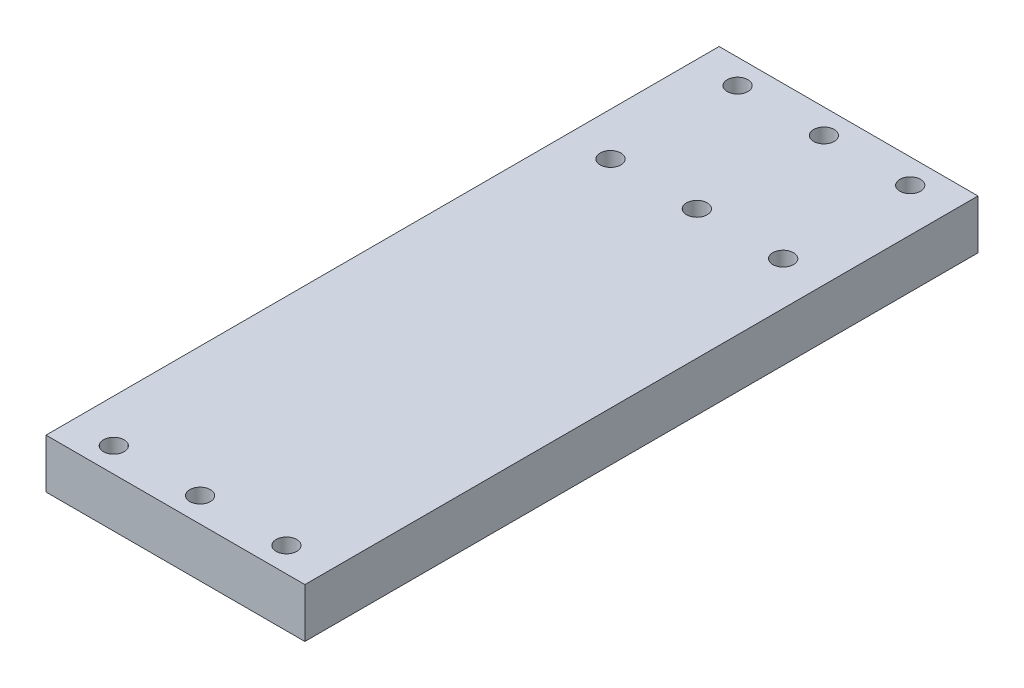
ISO-10303-21;
HEADER;
FILE_DESCRIPTION(('STEP AP214'),'2;1');
FILE_NAME('part.step','',(''),(''),'','','');
FILE_SCHEMA(('AUTOMOTIVE_DESIGN { 1 0 10303 214 1 1 1 1 }'));
ENDSEC;
DATA;
#1=APPLICATION_CONTEXT('core data for automotive mechanical design processes');
#2=APPLICATION_PROTOCOL_DEFINITION('international standard','automotive_design',2000,#1);
#3=PRODUCT_CONTEXT('',#1,'mechanical');
#4=PRODUCT('Part','Part','',(#3));
#5=PRODUCT_RELATED_PRODUCT_CATEGORY('part','',(#4));
#6=PRODUCT_DEFINITION_FORMATION('','',#4);
#7=PRODUCT_DEFINITION_CONTEXT('part definition',#1,'design');
#8=PRODUCT_DEFINITION('design','',#6,#7);
#9=PRODUCT_DEFINITION_SHAPE('','',#8);
#10=(LENGTH_UNIT() NAMED_UNIT(*) SI_UNIT(.MILLI.,.METRE.));
#11=(NAMED_UNIT(*) PLANE_ANGLE_UNIT() SI_UNIT($,.RADIAN.));
#12=(NAMED_UNIT(*) SI_UNIT($,.STERADIAN.) SOLID_ANGLE_UNIT());
#13=UNCERTAINTY_MEASURE_WITH_UNIT(LENGTH_MEASURE(1.E-05),#10,'distance_accuracy_value','');
#14=(GEOMETRIC_REPRESENTATION_CONTEXT(3) GLOBAL_UNCERTAINTY_ASSIGNED_CONTEXT((#13)) GLOBAL_UNIT_ASSIGNED_CONTEXT((#10,
#11,#12)) REPRESENTATION_CONTEXT('',''));
#15=CARTESIAN_POINT('',(0.,0.,0.));
#16=DIRECTION('',(0.,0.,1.));
#17=DIRECTION('',(1.,0.,0.));
#18=AXIS2_PLACEMENT_3D('',#15,#16,#17);
#19=CARTESIAN_POINT('',(25.,9.525,65.));
#20=DIRECTION('',(-1.,0.,0.));
#21=DIRECTION('',(0.,0.,1.));
#22=AXIS2_PLACEMENT_3D('',#19,#20,#21);
#23=PLANE('',#22);
#24=DIRECTION('',(0.,0.,-1.));
#25=VECTOR('',#24,1.);
#26=CARTESIAN_POINT('',(25.,0.,65.));
#27=LINE('',#26,#25);
#28=CARTESIAN_POINT('',(25.,0.,65.));
#29=VERTEX_POINT('',#28);
#30=CARTESIAN_POINT('',(25.,0.,-65.));
#31=VERTEX_POINT('',#30);
#32=EDGE_CURVE('E102',#29,#31,#27,.T.);
#33=ORIENTED_EDGE('',*,*,#32,.T.);
#34=DIRECTION('',(0.,-1.,0.));
#35=VECTOR('',#34,1.);
#36=CARTESIAN_POINT('',(25.,9.525,-65.));
#37=LINE('',#36,#35);
#38=CARTESIAN_POINT('',(25.,9.525,-65.));
#39=VERTEX_POINT('',#38);
#40=EDGE_CURVE('E11',#39,#31,#37,.T.);
#41=ORIENTED_EDGE('',*,*,#40,.F.);
#42=DIRECTION('',(0.,0.,-1.));
#43=VECTOR('',#42,1.);
#44=CARTESIAN_POINT('',(25.,9.525,65.));
#45=LINE('',#44,#43);
#46=CARTESIAN_POINT('',(25.,9.525,65.));
#47=VERTEX_POINT('',#46);
#48=EDGE_CURVE('E90',#47,#39,#45,.T.);
#49=ORIENTED_EDGE('',*,*,#48,.F.);
#50=DIRECTION('',(0.,-1.,0.));
#51=VECTOR('',#50,1.);
#52=CARTESIAN_POINT('',(25.,9.525,65.));
#53=LINE('',#52,#51);
#54=EDGE_CURVE('E98',#47,#29,#53,.T.);
#55=ORIENTED_EDGE('',*,*,#54,.T.);
#56=EDGE_LOOP('',(#33,#41,#49,#55));
#57=FACE_BOUND('',#56,.T.);
#58=ADVANCED_FACE('F39',(#57),#23,.F.);
#59=CARTESIAN_POINT('',(-25.,9.525,-65.));
#60=DIRECTION('',(0.,0.,1.));
#61=DIRECTION('',(1.,0.,0.));
#62=AXIS2_PLACEMENT_3D('',#59,#60,#61);
#63=PLANE('',#62);
#64=DIRECTION('',(-1.,0.,0.));
#65=VECTOR('',#64,1.);
#66=CARTESIAN_POINT('',(-25.,0.,-65.));
#67=LINE('',#66,#65);
#68=CARTESIAN_POINT('',(-25.,0.,-65.));
#69=VERTEX_POINT('',#68);
#70=EDGE_CURVE('E94',#31,#69,#67,.T.);
#71=ORIENTED_EDGE('',*,*,#70,.T.);
#72=DIRECTION('',(0.,-1.,0.));
#73=VECTOR('',#72,1.);
#74=CARTESIAN_POINT('',(-25.,9.525,-65.));
#75=LINE('',#74,#73);
#76=CARTESIAN_POINT('',(-25.,9.525,-65.));
#77=VERTEX_POINT('',#76);
#78=EDGE_CURVE('E47',#77,#69,#75,.T.);
#79=ORIENTED_EDGE('',*,*,#78,.F.);
#80=DIRECTION('',(-1.,0.,0.));
#81=VECTOR('',#80,1.);
#82=CARTESIAN_POINT('',(-25.,9.525,-65.));
#83=LINE('',#82,#81);
#84=EDGE_CURVE('E85',#39,#77,#83,.T.);
#85=ORIENTED_EDGE('',*,*,#84,.F.);
#86=ORIENTED_EDGE('',*,*,#40,.T.);
#87=EDGE_LOOP('',(#71,#79,#85,#86));
#88=FACE_BOUND('',#87,.T.);
#89=ADVANCED_FACE('F93',(#88),#63,.F.);
#90=CARTESIAN_POINT('',(-25.,9.525,65.));
#91=DIRECTION('',(1.,0.,0.));
#92=DIRECTION('',(0.,0.,-1.));
#93=AXIS2_PLACEMENT_3D('',#90,#91,#92);
#94=PLANE('',#93);
#95=DIRECTION('',(0.,0.,1.));
#96=VECTOR('',#95,1.);
#97=CARTESIAN_POINT('',(-25.,0.,65.));
#98=LINE('',#97,#96);
#99=CARTESIAN_POINT('',(-25.,0.,65.));
#100=VERTEX_POINT('',#99);
#101=EDGE_CURVE('E72',#69,#100,#98,.T.);
#102=ORIENTED_EDGE('',*,*,#101,.T.);
#103=DIRECTION('',(0.,-1.,0.));
#104=VECTOR('',#103,1.);
#105=CARTESIAN_POINT('',(-25.,9.525,65.));
#106=LINE('',#105,#104);
#107=CARTESIAN_POINT('',(-25.,9.525,65.));
#108=VERTEX_POINT('',#107);
#109=EDGE_CURVE('E95',#108,#100,#106,.T.);
#110=ORIENTED_EDGE('',*,*,#109,.F.);
#111=DIRECTION('',(0.,0.,1.));
#112=VECTOR('',#111,1.);
#113=CARTESIAN_POINT('',(-25.,9.525,65.));
#114=LINE('',#113,#112);
#115=EDGE_CURVE('E88',#77,#108,#114,.T.);
#116=ORIENTED_EDGE('',*,*,#115,.F.);
#117=ORIENTED_EDGE('',*,*,#78,.T.);
#118=EDGE_LOOP('',(#102,#110,#116,#117));
#119=FACE_BOUND('',#118,.T.);
#120=ADVANCED_FACE('F96',(#119),#94,.F.);
#121=CARTESIAN_POINT('',(-25.,9.525,65.));
#122=DIRECTION('',(0.,0.,-1.));
#123=DIRECTION('',(-1.,0.,0.));
#124=AXIS2_PLACEMENT_3D('',#121,#122,#123);
#125=PLANE('',#124);
#126=DIRECTION('',(1.,0.,0.));
#127=VECTOR('',#126,1.);
#128=CARTESIAN_POINT('',(-25.,0.,65.));
#129=LINE('',#128,#127);
#130=EDGE_CURVE('E78',#100,#29,#129,.T.);
#131=ORIENTED_EDGE('',*,*,#130,.T.);
#132=ORIENTED_EDGE('',*,*,#54,.F.);
#133=DIRECTION('',(1.,0.,0.));
#134=VECTOR('',#133,1.);
#135=CARTESIAN_POINT('',(-25.,9.525,65.));
#136=LINE('',#135,#134);
#137=EDGE_CURVE('E55',#108,#47,#136,.T.);
#138=ORIENTED_EDGE('',*,*,#137,.F.);
#139=ORIENTED_EDGE('',*,*,#109,.T.);
#140=EDGE_LOOP('',(#131,#132,#138,#139));
#141=FACE_BOUND('',#140,.T.);
#142=ADVANCED_FACE('F110',(#141),#125,.F.);
#143=CARTESIAN_POINT('',(0.,9.525,0.));
#144=DIRECTION('',(0.,-1.,0.));
#145=DIRECTION('',(0.,0.,-1.));
#146=AXIS2_PLACEMENT_3D('',#143,#144,#145);
#147=PLANE('',#146);
#148=CARTESIAN_POINT('',(-16.67,9.525,-35.7));
#149=DIRECTION('',(0.,-1.,0.));
#150=DIRECTION('',(0.,0.,-1.));
#151=AXIS2_PLACEMENT_3D('',#148,#149,#150);
#152=CIRCLE('',#151,2.);
#153=CARTESIAN_POINT('',(-16.67,9.525,-37.7));
#154=VERTEX_POINT('',#153);
#155=EDGE_CURVE('E163',#154,#154,#152,.T.);
#156=ORIENTED_EDGE('',*,*,#155,.T.);
#157=EDGE_LOOP('',(#156));
#158=FACE_BOUND('',#157,.T.);
#159=CARTESIAN_POINT('',(0.,9.525,-35.7));
#160=DIRECTION('',(0.,-1.,0.));
#161=DIRECTION('',(0.,0.,-1.));
#162=AXIS2_PLACEMENT_3D('',#159,#160,#161);
#163=CIRCLE('',#162,2.);
#164=CARTESIAN_POINT('',(0.,9.525,-37.7));
#165=VERTEX_POINT('',#164);
#166=EDGE_CURVE('E157',#165,#165,#163,.T.);
#167=ORIENTED_EDGE('',*,*,#166,.T.);
#168=EDGE_LOOP('',(#167));
#169=FACE_BOUND('',#168,.T.);
#170=CARTESIAN_POINT('',(16.67,9.525,-35.7));
#171=DIRECTION('',(0.,-1.,0.));
#172=DIRECTION('',(0.,0.,-1.));
#173=AXIS2_PLACEMENT_3D('',#170,#171,#172);
#174=CIRCLE('',#173,2.);
#175=CARTESIAN_POINT('',(16.67,9.525,-37.7));
#176=VERTEX_POINT('',#175);
#177=EDGE_CURVE('E151',#176,#176,#174,.T.);
#178=ORIENTED_EDGE('',*,*,#177,.T.);
#179=EDGE_LOOP('',(#178));
#180=FACE_BOUND('',#179,.T.);
#181=CARTESIAN_POINT('',(16.67,9.525,60.2375));
#182=DIRECTION('',(0.,-1.,0.));
#183=DIRECTION('',(0.,0.,-1.));
#184=AXIS2_PLACEMENT_3D('',#181,#182,#183);
#185=CIRCLE('',#184,2.);
#186=CARTESIAN_POINT('',(16.67,9.525,58.2375));
#187=VERTEX_POINT('',#186);
#188=EDGE_CURVE('E145',#187,#187,#185,.T.);
#189=ORIENTED_EDGE('',*,*,#188,.T.);
#190=EDGE_LOOP('',(#189));
#191=FACE_BOUND('',#190,.T.);
#192=CARTESIAN_POINT('',(0.,9.525,60.2375));
#193=DIRECTION('',(0.,-1.,0.));
#194=DIRECTION('',(0.,0.,-1.));
#195=AXIS2_PLACEMENT_3D('',#192,#193,#194);
#196=CIRCLE('',#195,2.);
#197=CARTESIAN_POINT('',(0.,9.525,58.2375));
#198=VERTEX_POINT('',#197);
#199=EDGE_CURVE('E139',#198,#198,#196,.T.);
#200=ORIENTED_EDGE('',*,*,#199,.T.);
#201=EDGE_LOOP('',(#200));
#202=FACE_BOUND('',#201,.T.);
#203=CARTESIAN_POINT('',(-16.67,9.525,60.2375));
#204=DIRECTION('',(0.,-1.,0.));
#205=DIRECTION('',(0.,0.,-1.));
#206=AXIS2_PLACEMENT_3D('',#203,#204,#205);
#207=CIRCLE('',#206,2.);
#208=CARTESIAN_POINT('',(-16.67,9.525,58.2375));
#209=VERTEX_POINT('',#208);
#210=EDGE_CURVE('E133',#209,#209,#207,.T.);
#211=ORIENTED_EDGE('',*,*,#210,.T.);
#212=EDGE_LOOP('',(#211));
#213=FACE_BOUND('',#212,.T.);
#214=CARTESIAN_POINT('',(16.6700000000011,9.525,-60.2374999999997));
#215=DIRECTION('',(0.,-1.,0.));
#216=DIRECTION('',(0.,0.,-1.));
#217=AXIS2_PLACEMENT_3D('',#214,#215,#216);
#218=CIRCLE('',#217,2.);
#219=CARTESIAN_POINT('',(16.6700000000011,9.525,-62.2374999999997));
#220=VERTEX_POINT('',#219);
#221=EDGE_CURVE('E127',#220,#220,#218,.T.);
#222=ORIENTED_EDGE('',*,*,#221,.T.);
#223=EDGE_LOOP('',(#222));
#224=FACE_BOUND('',#223,.T.);
#225=CARTESIAN_POINT('',(1.0989801176793E-12,9.525,-60.2374999999997));
#226=DIRECTION('',(0.,-1.,0.));
#227=DIRECTION('',(0.,0.,-1.));
#228=AXIS2_PLACEMENT_3D('',#225,#226,#227);
#229=CIRCLE('',#228,2.);
#230=CARTESIAN_POINT('',(1.0989801176793E-12,9.525,-62.2374999999997));
#231=VERTEX_POINT('',#230);
#232=EDGE_CURVE('E121',#231,#231,#229,.T.);
#233=ORIENTED_EDGE('',*,*,#232,.T.);
#234=EDGE_LOOP('',(#233));
#235=FACE_BOUND('',#234,.T.);
#236=CARTESIAN_POINT('',(-16.6699999999989,9.525,-60.2374999999997));
#237=DIRECTION('',(0.,-1.,0.));
#238=DIRECTION('',(0.,0.,-1.));
#239=AXIS2_PLACEMENT_3D('',#236,#237,#238);
#240=CIRCLE('',#239,2.);
#241=CARTESIAN_POINT('',(-16.6699999999989,9.525,-62.2374999999997));
#242=VERTEX_POINT('',#241);
#243=EDGE_CURVE('E105',#242,#242,#240,.T.);
#244=ORIENTED_EDGE('',*,*,#243,.T.);
#245=EDGE_LOOP('',(#244));
#246=FACE_BOUND('',#245,.T.);
#247=ORIENTED_EDGE('',*,*,#48,.T.);
#248=ORIENTED_EDGE('',*,*,#84,.T.);
#249=ORIENTED_EDGE('',*,*,#115,.T.);
#250=ORIENTED_EDGE('',*,*,#137,.T.);
#251=EDGE_LOOP('',(#247,#248,#249,#250));
#252=FACE_BOUND('',#251,.T.);
#253=ADVANCED_FACE('F86',(#158,#169,#180,#191,#202,#213,#224,#235,#246,#252),#147,.F.);
#254=CARTESIAN_POINT('',(0.,0.,0.));
#255=DIRECTION('',(0.,-1.,0.));
#256=DIRECTION('',(0.,0.,-1.));
#257=AXIS2_PLACEMENT_3D('',#254,#255,#256);
#258=PLANE('',#257);
#259=CARTESIAN_POINT('',(-16.67,0.,-35.7));
#260=DIRECTION('',(0.,-1.,0.));
#261=DIRECTION('',(0.,0.,-1.));
#262=AXIS2_PLACEMENT_3D('',#259,#260,#261);
#263=CIRCLE('',#262,1.99999999999999);
#264=CARTESIAN_POINT('',(-16.67,0.,-37.7));
#265=VERTEX_POINT('',#264);
#266=EDGE_CURVE('E166',#265,#265,#263,.T.);
#267=ORIENTED_EDGE('',*,*,#266,.F.);
#268=EDGE_LOOP('',(#267));
#269=FACE_BOUND('',#268,.T.);
#270=CARTESIAN_POINT('',(0.,0.,-35.7));
#271=DIRECTION('',(0.,-1.,0.));
#272=DIRECTION('',(0.,0.,-1.));
#273=AXIS2_PLACEMENT_3D('',#270,#271,#272);
#274=CIRCLE('',#273,1.99999999999999);
#275=CARTESIAN_POINT('',(0.,0.,-37.7));
#276=VERTEX_POINT('',#275);
#277=EDGE_CURVE('E160',#276,#276,#274,.T.);
#278=ORIENTED_EDGE('',*,*,#277,.F.);
#279=EDGE_LOOP('',(#278));
#280=FACE_BOUND('',#279,.T.);
#281=CARTESIAN_POINT('',(16.67,0.,-35.7));
#282=DIRECTION('',(0.,-1.,0.));
#283=DIRECTION('',(0.,0.,-1.));
#284=AXIS2_PLACEMENT_3D('',#281,#282,#283);
#285=CIRCLE('',#284,1.99999999999999);
#286=CARTESIAN_POINT('',(16.67,0.,-37.7));
#287=VERTEX_POINT('',#286);
#288=EDGE_CURVE('E154',#287,#287,#285,.T.);
#289=ORIENTED_EDGE('',*,*,#288,.F.);
#290=EDGE_LOOP('',(#289));
#291=FACE_BOUND('',#290,.T.);
#292=CARTESIAN_POINT('',(16.67,0.,60.2375));
#293=DIRECTION('',(0.,-1.,0.));
#294=DIRECTION('',(0.,0.,-1.));
#295=AXIS2_PLACEMENT_3D('',#292,#293,#294);
#296=CIRCLE('',#295,1.99999999999999);
#297=CARTESIAN_POINT('',(16.67,0.,58.2375));
#298=VERTEX_POINT('',#297);
#299=EDGE_CURVE('E148',#298,#298,#296,.T.);
#300=ORIENTED_EDGE('',*,*,#299,.F.);
#301=EDGE_LOOP('',(#300));
#302=FACE_BOUND('',#301,.T.);
#303=CARTESIAN_POINT('',(0.,0.,60.2375));
#304=DIRECTION('',(0.,-1.,0.));
#305=DIRECTION('',(0.,0.,-1.));
#306=AXIS2_PLACEMENT_3D('',#303,#304,#305);
#307=CIRCLE('',#306,1.99999999999999);
#308=CARTESIAN_POINT('',(0.,0.,58.2375));
#309=VERTEX_POINT('',#308);
#310=EDGE_CURVE('E142',#309,#309,#307,.T.);
#311=ORIENTED_EDGE('',*,*,#310,.F.);
#312=EDGE_LOOP('',(#311));
#313=FACE_BOUND('',#312,.T.);
#314=CARTESIAN_POINT('',(-16.67,0.,60.2375));
#315=DIRECTION('',(0.,-1.,0.));
#316=DIRECTION('',(0.,0.,-1.));
#317=AXIS2_PLACEMENT_3D('',#314,#315,#316);
#318=CIRCLE('',#317,1.99999999999999);
#319=CARTESIAN_POINT('',(-16.67,0.,58.2375));
#320=VERTEX_POINT('',#319);
#321=EDGE_CURVE('E136',#320,#320,#318,.T.);
#322=ORIENTED_EDGE('',*,*,#321,.F.);
#323=EDGE_LOOP('',(#322));
#324=FACE_BOUND('',#323,.T.);
#325=CARTESIAN_POINT('',(16.6700000000011,0.,-60.2374999999997));
#326=DIRECTION('',(0.,-1.,0.));
#327=DIRECTION('',(0.,0.,-1.));
#328=AXIS2_PLACEMENT_3D('',#325,#326,#327);
#329=CIRCLE('',#328,1.99999999999999);
#330=CARTESIAN_POINT('',(16.6700000000011,0.,-62.2374999999997));
#331=VERTEX_POINT('',#330);
#332=EDGE_CURVE('E130',#331,#331,#329,.T.);
#333=ORIENTED_EDGE('',*,*,#332,.F.);
#334=EDGE_LOOP('',(#333));
#335=FACE_BOUND('',#334,.T.);
#336=CARTESIAN_POINT('',(1.0989801176793E-12,0.,-60.2374999999997));
#337=DIRECTION('',(0.,-1.,0.));
#338=DIRECTION('',(0.,0.,-1.));
#339=AXIS2_PLACEMENT_3D('',#336,#337,#338);
#340=CIRCLE('',#339,1.99999999999999);
#341=CARTESIAN_POINT('',(1.0989801176793E-12,0.,-62.2374999999997));
#342=VERTEX_POINT('',#341);
#343=EDGE_CURVE('E124',#342,#342,#340,.T.);
#344=ORIENTED_EDGE('',*,*,#343,.F.);
#345=EDGE_LOOP('',(#344));
#346=FACE_BOUND('',#345,.T.);
#347=CARTESIAN_POINT('',(-16.6699999999989,0.,-60.2374999999997));
#348=DIRECTION('',(0.,-1.,0.));
#349=DIRECTION('',(0.,0.,-1.));
#350=AXIS2_PLACEMENT_3D('',#347,#348,#349);
#351=CIRCLE('',#350,1.99999999999999);
#352=CARTESIAN_POINT('',(-16.6699999999989,0.,-62.2374999999997));
#353=VERTEX_POINT('',#352);
#354=EDGE_CURVE('E118',#353,#353,#351,.T.);
#355=ORIENTED_EDGE('',*,*,#354,.F.);
#356=EDGE_LOOP('',(#355));
#357=FACE_BOUND('',#356,.T.);
#358=ORIENTED_EDGE('',*,*,#32,.F.);
#359=ORIENTED_EDGE('',*,*,#130,.F.);
#360=ORIENTED_EDGE('',*,*,#101,.F.);
#361=ORIENTED_EDGE('',*,*,#70,.F.);
#362=EDGE_LOOP('',(#358,#359,#360,#361));
#363=FACE_BOUND('',#362,.T.);
#364=ADVANCED_FACE('F113',(#269,#280,#291,#302,#313,#324,#335,#346,#357,#363),#258,.T.);
#365=CARTESIAN_POINT('',(-16.6699999999989,0.,-60.2374999999997));
#366=DIRECTION('',(0.,-1.,0.));
#367=DIRECTION('',(0.,0.,-1.));
#368=AXIS2_PLACEMENT_3D('',#365,#366,#367);
#369=CYLINDRICAL_SURFACE('',#368,1.99999999999999);
#370=ORIENTED_EDGE('',*,*,#243,.F.);
#371=EDGE_LOOP('',(#370));
#372=FACE_BOUND('',#371,.T.);
#373=ORIENTED_EDGE('',*,*,#354,.T.);
#374=EDGE_LOOP('',(#373));
#375=FACE_BOUND('',#374,.T.);
#376=ADVANCED_FACE('F174',(#372,#375),#369,.F.);
#377=CARTESIAN_POINT('',(1.0989801176793E-12,0.,-60.2374999999997));
#378=DIRECTION('',(0.,-1.,0.));
#379=DIRECTION('',(0.,0.,-1.));
#380=AXIS2_PLACEMENT_3D('',#377,#378,#379);
#381=CYLINDRICAL_SURFACE('',#380,1.99999999999999);
#382=ORIENTED_EDGE('',*,*,#232,.F.);
#383=EDGE_LOOP('',(#382));
#384=FACE_BOUND('',#383,.T.);
#385=ORIENTED_EDGE('',*,*,#343,.T.);
#386=EDGE_LOOP('',(#385));
#387=FACE_BOUND('',#386,.T.);
#388=ADVANCED_FACE('F193',(#384,#387),#381,.F.);
#389=CARTESIAN_POINT('',(16.6700000000011,0.,-60.2374999999997));
#390=DIRECTION('',(0.,-1.,0.));
#391=DIRECTION('',(0.,0.,-1.));
#392=AXIS2_PLACEMENT_3D('',#389,#390,#391);
#393=CYLINDRICAL_SURFACE('',#392,1.99999999999999);
#394=ORIENTED_EDGE('',*,*,#221,.F.);
#395=EDGE_LOOP('',(#394));
#396=FACE_BOUND('',#395,.T.);
#397=ORIENTED_EDGE('',*,*,#332,.T.);
#398=EDGE_LOOP('',(#397));
#399=FACE_BOUND('',#398,.T.);
#400=ADVANCED_FACE('F199',(#396,#399),#393,.F.);
#401=CARTESIAN_POINT('',(-16.67,0.,60.2375));
#402=DIRECTION('',(0.,-1.,0.));
#403=DIRECTION('',(0.,0.,-1.));
#404=AXIS2_PLACEMENT_3D('',#401,#402,#403);
#405=CYLINDRICAL_SURFACE('',#404,1.99999999999999);
#406=ORIENTED_EDGE('',*,*,#210,.F.);
#407=EDGE_LOOP('',(#406));
#408=FACE_BOUND('',#407,.T.);
#409=ORIENTED_EDGE('',*,*,#321,.T.);
#410=EDGE_LOOP('',(#409));
#411=FACE_BOUND('',#410,.T.);
#412=ADVANCED_FACE('F238',(#408,#411),#405,.F.);
#413=CARTESIAN_POINT('',(0.,0.,60.2375));
#414=DIRECTION('',(0.,-1.,0.));
#415=DIRECTION('',(0.,0.,-1.));
#416=AXIS2_PLACEMENT_3D('',#413,#414,#415);
#417=CYLINDRICAL_SURFACE('',#416,1.99999999999999);
#418=ORIENTED_EDGE('',*,*,#199,.F.);
#419=EDGE_LOOP('',(#418));
#420=FACE_BOUND('',#419,.T.);
#421=ORIENTED_EDGE('',*,*,#310,.T.);
#422=EDGE_LOOP('',(#421));
#423=FACE_BOUND('',#422,.T.);
#424=ADVANCED_FACE('F243',(#420,#423),#417,.F.);
#425=CARTESIAN_POINT('',(16.67,0.,60.2375));
#426=DIRECTION('',(0.,-1.,0.));
#427=DIRECTION('',(0.,0.,-1.));
#428=AXIS2_PLACEMENT_3D('',#425,#426,#427);
#429=CYLINDRICAL_SURFACE('',#428,1.99999999999999);
#430=ORIENTED_EDGE('',*,*,#188,.F.);
#431=EDGE_LOOP('',(#430));
#432=FACE_BOUND('',#431,.T.);
#433=ORIENTED_EDGE('',*,*,#299,.T.);
#434=EDGE_LOOP('',(#433));
#435=FACE_BOUND('',#434,.T.);
#436=ADVANCED_FACE('F249',(#432,#435),#429,.F.);
#437=CARTESIAN_POINT('',(16.67,0.,-35.7));
#438=DIRECTION('',(0.,-1.,0.));
#439=DIRECTION('',(0.,0.,-1.));
#440=AXIS2_PLACEMENT_3D('',#437,#438,#439);
#441=CYLINDRICAL_SURFACE('',#440,1.99999999999999);
#442=ORIENTED_EDGE('',*,*,#177,.F.);
#443=EDGE_LOOP('',(#442));
#444=FACE_BOUND('',#443,.T.);
#445=ORIENTED_EDGE('',*,*,#288,.T.);
#446=EDGE_LOOP('',(#445));
#447=FACE_BOUND('',#446,.T.);
#448=ADVANCED_FACE('F253',(#444,#447),#441,.F.);
#449=CARTESIAN_POINT('',(0.,0.,-35.7));
#450=DIRECTION('',(0.,-1.,0.));
#451=DIRECTION('',(0.,0.,-1.));
#452=AXIS2_PLACEMENT_3D('',#449,#450,#451);
#453=CYLINDRICAL_SURFACE('',#452,1.99999999999999);
#454=ORIENTED_EDGE('',*,*,#166,.F.);
#455=EDGE_LOOP('',(#454));
#456=FACE_BOUND('',#455,.T.);
#457=ORIENTED_EDGE('',*,*,#277,.T.);
#458=EDGE_LOOP('',(#457));
#459=FACE_BOUND('',#458,.T.);
#460=ADVANCED_FACE('F257',(#456,#459),#453,.F.);
#461=CARTESIAN_POINT('',(-16.67,0.,-35.7));
#462=DIRECTION('',(0.,-1.,0.));
#463=DIRECTION('',(0.,0.,-1.));
#464=AXIS2_PLACEMENT_3D('',#461,#462,#463);
#465=CYLINDRICAL_SURFACE('',#464,1.99999999999999);
#466=ORIENTED_EDGE('',*,*,#155,.F.);
#467=EDGE_LOOP('',(#466));
#468=FACE_BOUND('',#467,.T.);
#469=ORIENTED_EDGE('',*,*,#266,.T.);
#470=EDGE_LOOP('',(#469));
#471=FACE_BOUND('',#470,.T.);
#472=ADVANCED_FACE('F170',(#468,#471),#465,.F.);
#473=CLOSED_SHELL('',(#58,#89,#120,#142,#253,#364,#376,#388,#400,#412,#424,#436,#448,#460,#472));
#474=MANIFOLD_SOLID_BREP('B2',#473);
#475=ADVANCED_BREP_SHAPE_REPRESENTATION('',(#18,#474),#14);
#476=SHAPE_DEFINITION_REPRESENTATION(#9,#475);
ENDSEC;
END-ISO-10303-21;
